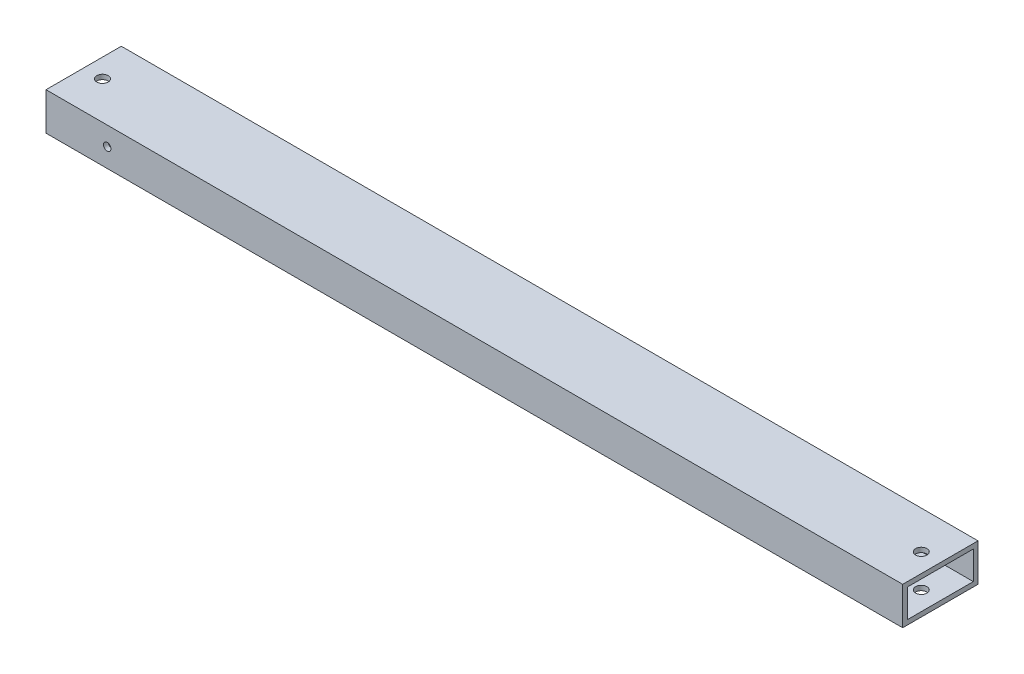
ISO-10303-21;
HEADER;
FILE_DESCRIPTION(('STEP AP214'),'2;1');
FILE_NAME('part.step','',(''),(''),'','','');
FILE_SCHEMA(('AUTOMOTIVE_DESIGN { 1 0 10303 214 1 1 1 1 }'));
ENDSEC;
DATA;
#1=APPLICATION_CONTEXT('core data for automotive mechanical design processes');
#2=APPLICATION_PROTOCOL_DEFINITION('international standard','automotive_design',2000,#1);
#3=PRODUCT_CONTEXT('',#1,'mechanical');
#4=PRODUCT('Part','Part','',(#3));
#5=PRODUCT_RELATED_PRODUCT_CATEGORY('part','',(#4));
#6=PRODUCT_DEFINITION_FORMATION('','',#4);
#7=PRODUCT_DEFINITION_CONTEXT('part definition',#1,'design');
#8=PRODUCT_DEFINITION('design','',#6,#7);
#9=PRODUCT_DEFINITION_SHAPE('','',#8);
#10=(LENGTH_UNIT() NAMED_UNIT(*) SI_UNIT(.MILLI.,.METRE.));
#11=(NAMED_UNIT(*) PLANE_ANGLE_UNIT() SI_UNIT($,.RADIAN.));
#12=(NAMED_UNIT(*) SI_UNIT($,.STERADIAN.) SOLID_ANGLE_UNIT());
#13=UNCERTAINTY_MEASURE_WITH_UNIT(LENGTH_MEASURE(1.E-05),#10,'distance_accuracy_value','');
#14=(GEOMETRIC_REPRESENTATION_CONTEXT(3) GLOBAL_UNCERTAINTY_ASSIGNED_CONTEXT((#13)) GLOBAL_UNIT_ASSIGNED_CONTEXT((#10,
#11,#12)) REPRESENTATION_CONTEXT('',''));
#15=CARTESIAN_POINT('',(0.,0.,0.));
#16=DIRECTION('',(0.,0.,1.));
#17=DIRECTION('',(1.,0.,0.));
#18=AXIS2_PLACEMENT_3D('',#15,#16,#17);
#19=CARTESIAN_POINT('',(238.313908971209,-659.905523336291,-866.236135779287));
#20=DIRECTION('',(0.,-1.,0.));
#21=DIRECTION('',(0.,0.,-1.));
#22=AXIS2_PLACEMENT_3D('',#19,#20,#21);
#23=CYLINDRICAL_SURFACE('',#22,6.);
#24=CARTESIAN_POINT('',(238.313908971209,-664.905523336291,-866.236135779287));
#25=DIRECTION('',(0.,-1.,0.));
#26=DIRECTION('',(0.,0.,-1.));
#27=AXIS2_PLACEMENT_3D('',#24,#25,#26);
#28=CIRCLE('',#27,6.);
#29=CARTESIAN_POINT('',(238.313908971209,-664.905523336291,-872.236135779287));
#30=VERTEX_POINT('',#29);
#31=EDGE_CURVE('E18',#30,#30,#28,.F.);
#32=ORIENTED_EDGE('',*,*,#31,.F.);
#33=EDGE_LOOP('',(#32));
#34=FACE_BOUND('',#33,.T.);
#35=CARTESIAN_POINT('',(238.313908971209,-659.905523336291,-866.236135779287));
#36=DIRECTION('',(0.,-1.,0.));
#37=DIRECTION('',(0.,0.,-1.));
#38=AXIS2_PLACEMENT_3D('',#35,#36,#37);
#39=CIRCLE('',#38,6.);
#40=CARTESIAN_POINT('',(238.313908971209,-659.905523336291,-872.236135779287));
#41=VERTEX_POINT('',#40);
#42=EDGE_CURVE('E143',#41,#41,#39,.F.);
#43=ORIENTED_EDGE('',*,*,#42,.T.);
#44=EDGE_LOOP('',(#43));
#45=FACE_BOUND('',#44,.T.);
#46=ADVANCED_FACE('F15',(#34,#45),#23,.F.);
#47=CARTESIAN_POINT('',(-631.679347611488,-699.905523336291,-866.486147986318));
#48=DIRECTION('',(0.,1.,0.));
#49=DIRECTION('',(0.,0.,1.));
#50=AXIS2_PLACEMENT_3D('',#47,#48,#49);
#51=CYLINDRICAL_SURFACE('',#50,6.);
#52=CARTESIAN_POINT('',(-631.679347611488,-664.905523336291,-866.486147986318));
#53=DIRECTION('',(0.,1.,0.));
#54=DIRECTION('',(0.,0.,1.));
#55=AXIS2_PLACEMENT_3D('',#52,#53,#54);
#56=CIRCLE('',#55,6.);
#57=CARTESIAN_POINT('',(-631.679347611488,-664.905523336291,-860.486147986318));
#58=VERTEX_POINT('',#57);
#59=EDGE_CURVE('E116',#58,#58,#56,.T.);
#60=ORIENTED_EDGE('',*,*,#59,.F.);
#61=EDGE_LOOP('',(#60));
#62=FACE_BOUND('',#61,.T.);
#63=CARTESIAN_POINT('',(-631.679347611488,-659.905523336291,-866.486147986318));
#64=DIRECTION('',(0.,1.,0.));
#65=DIRECTION('',(0.,0.,1.));
#66=AXIS2_PLACEMENT_3D('',#63,#64,#65);
#67=CIRCLE('',#66,6.);
#68=CARTESIAN_POINT('',(-631.679347611488,-659.905523336291,-860.486147986318));
#69=VERTEX_POINT('',#68);
#70=EDGE_CURVE('E140',#69,#69,#67,.T.);
#71=ORIENTED_EDGE('',*,*,#70,.T.);
#72=EDGE_LOOP('',(#71));
#73=FACE_BOUND('',#72,.T.);
#74=ADVANCED_FACE('F157',(#62,#73),#51,.F.);
#75=CARTESIAN_POINT('',(-586.679347611488,-679.845523336292,-898.986147986318));
#76=DIRECTION('',(0.,0.,-1.));
#77=DIRECTION('',(-1.,0.,0.));
#78=AXIS2_PLACEMENT_3D('',#75,#76,#77);
#79=CYLINDRICAL_SURFACE('',#78,4.);
#80=CARTESIAN_POINT('',(-586.679347611488,-679.845523336292,-901.486147986318));
#81=DIRECTION('',(0.,0.,-1.));
#82=DIRECTION('',(-1.,0.,0.));
#83=AXIS2_PLACEMENT_3D('',#80,#81,#82);
#84=CIRCLE('',#83,4.);
#85=CARTESIAN_POINT('',(-590.679347611488,-679.845523336292,-901.486147986318));
#86=VERTEX_POINT('',#85);
#87=EDGE_CURVE('E115',#86,#86,#84,.T.);
#88=ORIENTED_EDGE('',*,*,#87,.F.);
#89=EDGE_LOOP('',(#88));
#90=FACE_BOUND('',#89,.T.);
#91=CARTESIAN_POINT('',(-586.679347611488,-679.845523336292,-906.486147986318));
#92=DIRECTION('',(0.,0.,-1.));
#93=DIRECTION('',(-1.,0.,0.));
#94=AXIS2_PLACEMENT_3D('',#91,#92,#93);
#95=CIRCLE('',#94,4.);
#96=CARTESIAN_POINT('',(-590.679347611488,-679.845523336292,-906.486147986318));
#97=VERTEX_POINT('',#96);
#98=EDGE_CURVE('E133',#97,#97,#95,.T.);
#99=ORIENTED_EDGE('',*,*,#98,.T.);
#100=EDGE_LOOP('',(#99));
#101=FACE_BOUND('',#100,.T.);
#102=ADVANCED_FACE('F251',(#90,#101),#79,.F.);
#103=CARTESIAN_POINT('',(-201.679347611488,-679.905523336292,-831.486147986319));
#104=DIRECTION('',(0.,0.,-1.));
#105=DIRECTION('',(-1.,0.,0.));
#106=AXIS2_PLACEMENT_3D('',#103,#104,#105);
#107=PLANE('',#106);
#108=CARTESIAN_POINT('',(-586.679347611488,-679.845523336292,-831.486147986319));
#109=DIRECTION('',(0.,0.,1.));
#110=DIRECTION('',(1.,0.,0.));
#111=AXIS2_PLACEMENT_3D('',#108,#109,#110);
#112=CIRCLE('',#111,4.);
#113=CARTESIAN_POINT('',(-582.679347611488,-679.845523336292,-831.486147986319));
#114=VERTEX_POINT('',#113);
#115=EDGE_CURVE('E113',#114,#114,#112,.T.);
#116=ORIENTED_EDGE('',*,*,#115,.T.);
#117=EDGE_LOOP('',(#116));
#118=FACE_BOUND('',#117,.T.);
#119=DIRECTION('',(1.,0.,0.));
#120=VECTOR('',#119,1.);
#121=CARTESIAN_POINT('',(-201.679347611488,-694.905523336291,-831.486147986319));
#122=LINE('',#121,#120);
#123=CARTESIAN_POINT('',(-651.679347611489,-694.905523336291,-831.486147986319));
#124=VERTEX_POINT('',#123);
#125=CARTESIAN_POINT('',(258.313908971212,-694.905523336291,-831.486147986319));
#126=VERTEX_POINT('',#125);
#127=EDGE_CURVE('E103',#124,#126,#122,.T.);
#128=ORIENTED_EDGE('',*,*,#127,.F.);
#129=DIRECTION('',(0.,1.,0.));
#130=VECTOR('',#129,1.);
#131=CARTESIAN_POINT('',(-651.679347611489,-679.905523336292,-831.486147986319));
#132=LINE('',#131,#130);
#133=CARTESIAN_POINT('',(-651.679347611489,-664.905523336291,-831.486147986319));
#134=VERTEX_POINT('',#133);
#135=EDGE_CURVE('E189',#124,#134,#132,.T.);
#136=ORIENTED_EDGE('',*,*,#135,.T.);
#137=DIRECTION('',(1.,0.,0.));
#138=VECTOR('',#137,1.);
#139=CARTESIAN_POINT('',(-201.679347611488,-664.905523336291,-831.486147986319));
#140=LINE('',#139,#138);
#141=CARTESIAN_POINT('',(258.313908971212,-664.905523336291,-831.486147986319));
#142=VERTEX_POINT('',#141);
#143=EDGE_CURVE('E117',#142,#134,#140,.F.);
#144=ORIENTED_EDGE('',*,*,#143,.F.);
#145=DIRECTION('',(0.,1.,0.));
#146=VECTOR('',#145,1.);
#147=CARTESIAN_POINT('',(258.313908971212,-680.155520569218,-831.486147986319));
#148=LINE('',#147,#146);
#149=EDGE_CURVE('E106',#126,#142,#148,.T.);
#150=ORIENTED_EDGE('',*,*,#149,.F.);
#151=EDGE_LOOP('',(#128,#136,#144,#150));
#152=FACE_BOUND('',#151,.T.);
#153=ADVANCED_FACE('F248',(#118,#152),#107,.T.);
#154=CARTESIAN_POINT('',(-201.679347611488,-664.905523336291,-866.486147986318));
#155=DIRECTION('',(0.,-1.,0.));
#156=DIRECTION('',(0.,0.,-1.));
#157=AXIS2_PLACEMENT_3D('',#154,#155,#156);
#158=PLANE('',#157);
#159=ORIENTED_EDGE('',*,*,#59,.T.);
#160=EDGE_LOOP('',(#159));
#161=FACE_BOUND('',#160,.T.);
#162=ORIENTED_EDGE('',*,*,#31,.T.);
#163=EDGE_LOOP('',(#162));
#164=FACE_BOUND('',#163,.T.);
#165=ORIENTED_EDGE('',*,*,#143,.T.);
#166=DIRECTION('',(0.,0.,-1.));
#167=VECTOR('',#166,1.);
#168=CARTESIAN_POINT('',(-651.679347611489,-664.905523336291,-866.486147986318));
#169=LINE('',#168,#167);
#170=CARTESIAN_POINT('',(-651.679347611489,-664.905523336291,-901.486147986318));
#171=VERTEX_POINT('',#170);
#172=EDGE_CURVE('E187',#134,#171,#169,.T.);
#173=ORIENTED_EDGE('',*,*,#172,.T.);
#174=DIRECTION('',(1.,0.,0.));
#175=VECTOR('',#174,1.);
#176=CARTESIAN_POINT('',(-201.679347611488,-664.905523336291,-901.486147986318));
#177=LINE('',#176,#175);
#178=CARTESIAN_POINT('',(258.313908971212,-664.905523336291,-901.486147986318));
#179=VERTEX_POINT('',#178);
#180=EDGE_CURVE('E78',#179,#171,#177,.F.);
#181=ORIENTED_EDGE('',*,*,#180,.F.);
#182=DIRECTION('',(0.,0.,-1.));
#183=VECTOR('',#182,1.);
#184=CARTESIAN_POINT('',(258.313908971212,-664.905523336291,-866.486147986318));
#185=LINE('',#184,#183);
#186=EDGE_CURVE('E91',#142,#179,#185,.T.);
#187=ORIENTED_EDGE('',*,*,#186,.F.);
#188=EDGE_LOOP('',(#165,#173,#181,#187));
#189=FACE_BOUND('',#188,.T.);
#190=ADVANCED_FACE('F153',(#161,#164,#189),#158,.T.);
#191=CARTESIAN_POINT('',(-201.679347611488,-679.905523336292,-901.486147986318));
#192=DIRECTION('',(0.,0.,1.));
#193=DIRECTION('',(1.,0.,0.));
#194=AXIS2_PLACEMENT_3D('',#191,#192,#193);
#195=PLANE('',#194);
#196=ORIENTED_EDGE('',*,*,#87,.T.);
#197=EDGE_LOOP('',(#196));
#198=FACE_BOUND('',#197,.T.);
#199=ORIENTED_EDGE('',*,*,#180,.T.);
#200=DIRECTION('',(0.,1.,0.));
#201=VECTOR('',#200,1.);
#202=CARTESIAN_POINT('',(-651.679347611489,-679.905523336292,-901.486147986318));
#203=LINE('',#202,#201);
#204=CARTESIAN_POINT('',(-651.679347611489,-694.905523336291,-901.486147986318));
#205=VERTEX_POINT('',#204);
#206=EDGE_CURVE('E99',#171,#205,#203,.F.);
#207=ORIENTED_EDGE('',*,*,#206,.T.);
#208=DIRECTION('',(1.,0.,0.));
#209=VECTOR('',#208,1.);
#210=CARTESIAN_POINT('',(-201.679347611488,-694.905523336291,-901.486147986318));
#211=LINE('',#210,#209);
#212=CARTESIAN_POINT('',(258.313908971212,-694.905523336291,-901.486147986318));
#213=VERTEX_POINT('',#212);
#214=EDGE_CURVE('E96',#213,#205,#211,.F.);
#215=ORIENTED_EDGE('',*,*,#214,.F.);
#216=DIRECTION('',(0.,1.,0.));
#217=VECTOR('',#216,1.);
#218=CARTESIAN_POINT('',(258.313908971212,-680.155520569218,-901.486147986318));
#219=LINE('',#218,#217);
#220=EDGE_CURVE('E84',#179,#213,#219,.F.);
#221=ORIENTED_EDGE('',*,*,#220,.F.);
#222=EDGE_LOOP('',(#199,#207,#215,#221));
#223=FACE_BOUND('',#222,.T.);
#224=ADVANCED_FACE('F97',(#198,#223),#195,.T.);
#225=CARTESIAN_POINT('',(-201.679347611488,-659.905523336291,-866.486147986318));
#226=DIRECTION('',(0.,-1.,0.));
#227=DIRECTION('',(0.,0.,-1.));
#228=AXIS2_PLACEMENT_3D('',#225,#226,#227);
#229=PLANE('',#228);
#230=ORIENTED_EDGE('',*,*,#70,.F.);
#231=EDGE_LOOP('',(#230));
#232=FACE_BOUND('',#231,.T.);
#233=ORIENTED_EDGE('',*,*,#42,.F.);
#234=EDGE_LOOP('',(#233));
#235=FACE_BOUND('',#234,.T.);
#236=DIRECTION('',(0.,0.,-1.));
#237=VECTOR('',#236,1.);
#238=CARTESIAN_POINT('',(-651.679347611489,-659.905523336291,-866.486147986318));
#239=LINE('',#238,#237);
#240=CARTESIAN_POINT('',(-651.679347611489,-659.905523336291,-906.486147986318));
#241=VERTEX_POINT('',#240);
#242=CARTESIAN_POINT('',(-651.679347611489,-659.905523336291,-826.486147986318));
#243=VERTEX_POINT('',#242);
#244=EDGE_CURVE('E136',#241,#243,#239,.F.);
#245=ORIENTED_EDGE('',*,*,#244,.T.);
#246=DIRECTION('',(-1.,0.,0.));
#247=VECTOR('',#246,1.);
#248=CARTESIAN_POINT('',(-201.679347611488,-659.905523336291,-826.486147986318));
#249=LINE('',#248,#247);
#250=CARTESIAN_POINT('',(258.313908971212,-659.905523336291,-826.486147986318));
#251=VERTEX_POINT('',#250);
#252=EDGE_CURVE('E132',#243,#251,#249,.F.);
#253=ORIENTED_EDGE('',*,*,#252,.T.);
#254=DIRECTION('',(0.,0.,-1.));
#255=VECTOR('',#254,1.);
#256=CARTESIAN_POINT('',(258.313908971212,-659.905523336291,-866.486147986318));
#257=LINE('',#256,#255);
#258=CARTESIAN_POINT('',(258.313908971212,-659.905523336291,-906.486147986318));
#259=VERTEX_POINT('',#258);
#260=EDGE_CURVE('E93',#259,#251,#257,.F.);
#261=ORIENTED_EDGE('',*,*,#260,.F.);
#262=DIRECTION('',(1.,0.,0.));
#263=VECTOR('',#262,1.);
#264=CARTESIAN_POINT('',(-201.679347611488,-659.905523336291,-906.486147986318));
#265=LINE('',#264,#263);
#266=EDGE_CURVE('E137',#259,#241,#265,.F.);
#267=ORIENTED_EDGE('',*,*,#266,.T.);
#268=EDGE_LOOP('',(#245,#253,#261,#267));
#269=FACE_BOUND('',#268,.T.);
#270=ADVANCED_FACE('F160',(#232,#235,#269),#229,.F.);
#271=CARTESIAN_POINT('',(-586.679347611488,-679.845523336292,-833.986147986319));
#272=DIRECTION('',(0.,0.,1.));
#273=DIRECTION('',(1.,0.,0.));
#274=AXIS2_PLACEMENT_3D('',#271,#272,#273);
#275=CYLINDRICAL_SURFACE('',#274,4.);
#276=ORIENTED_EDGE('',*,*,#115,.F.);
#277=EDGE_LOOP('',(#276));
#278=FACE_BOUND('',#277,.T.);
#279=CARTESIAN_POINT('',(-586.679347611488,-679.845523336292,-826.486147986318));
#280=DIRECTION('',(0.,0.,1.));
#281=DIRECTION('',(1.,0.,0.));
#282=AXIS2_PLACEMENT_3D('',#279,#280,#281);
#283=CIRCLE('',#282,4.);
#284=CARTESIAN_POINT('',(-582.679347611488,-679.845523336292,-826.486147986318));
#285=VERTEX_POINT('',#284);
#286=EDGE_CURVE('E129',#285,#285,#283,.T.);
#287=ORIENTED_EDGE('',*,*,#286,.T.);
#288=EDGE_LOOP('',(#287));
#289=FACE_BOUND('',#288,.T.);
#290=ADVANCED_FACE('F163',(#278,#289),#275,.F.);
#291=CARTESIAN_POINT('',(-201.679347611488,-694.905523336291,-866.486147986318));
#292=DIRECTION('',(0.,1.,0.));
#293=DIRECTION('',(0.,0.,1.));
#294=AXIS2_PLACEMENT_3D('',#291,#292,#293);
#295=PLANE('',#294);
#296=CARTESIAN_POINT('',(-631.679347611488,-694.905523336291,-866.486147986318));
#297=DIRECTION('',(0.,1.,0.));
#298=DIRECTION('',(0.,0.,1.));
#299=AXIS2_PLACEMENT_3D('',#296,#297,#298);
#300=CIRCLE('',#299,6.);
#301=CARTESIAN_POINT('',(-631.679347611488,-694.905523336291,-860.486147986318));
#302=VERTEX_POINT('',#301);
#303=EDGE_CURVE('E122',#302,#302,#300,.F.);
#304=ORIENTED_EDGE('',*,*,#303,.T.);
#305=EDGE_LOOP('',(#304));
#306=FACE_BOUND('',#305,.T.);
#307=CARTESIAN_POINT('',(238.313908971209,-694.905523336291,-866.236135779287));
#308=DIRECTION('',(0.,-1.,0.));
#309=DIRECTION('',(0.,0.,-1.));
#310=AXIS2_PLACEMENT_3D('',#307,#308,#309);
#311=CIRCLE('',#310,6.);
#312=CARTESIAN_POINT('',(238.313908971209,-694.905523336291,-872.236135779287));
#313=VERTEX_POINT('',#312);
#314=EDGE_CURVE('E126',#313,#313,#311,.T.);
#315=ORIENTED_EDGE('',*,*,#314,.T.);
#316=EDGE_LOOP('',(#315));
#317=FACE_BOUND('',#316,.T.);
#318=ORIENTED_EDGE('',*,*,#214,.T.);
#319=DIRECTION('',(0.,0.,-1.));
#320=VECTOR('',#319,1.);
#321=CARTESIAN_POINT('',(-651.679347611489,-694.905523336291,-866.486147986318));
#322=LINE('',#321,#320);
#323=EDGE_CURVE('E192',#205,#124,#322,.F.);
#324=ORIENTED_EDGE('',*,*,#323,.T.);
#325=ORIENTED_EDGE('',*,*,#127,.T.);
#326=DIRECTION('',(0.,0.,-1.));
#327=VECTOR('',#326,1.);
#328=CARTESIAN_POINT('',(258.313908971212,-694.905523336291,-866.486147986318));
#329=LINE('',#328,#327);
#330=EDGE_CURVE('E89',#213,#126,#329,.F.);
#331=ORIENTED_EDGE('',*,*,#330,.F.);
#332=EDGE_LOOP('',(#318,#324,#325,#331));
#333=FACE_BOUND('',#332,.T.);
#334=ADVANCED_FACE('F105',(#306,#317,#333),#295,.T.);
#335=CARTESIAN_POINT('',(258.313908971212,-680.155520569218,-866.486147986318));
#336=DIRECTION('',(1.,0.,0.));
#337=DIRECTION('',(0.,0.,-1.));
#338=AXIS2_PLACEMENT_3D('',#335,#336,#337);
#339=PLANE('',#338);
#340=ORIENTED_EDGE('',*,*,#149,.T.);
#341=ORIENTED_EDGE('',*,*,#186,.T.);
#342=ORIENTED_EDGE('',*,*,#220,.T.);
#343=ORIENTED_EDGE('',*,*,#330,.T.);
#344=EDGE_LOOP('',(#340,#341,#342,#343));
#345=FACE_BOUND('',#344,.T.);
#346=DIRECTION('',(0.,1.,0.));
#347=VECTOR('',#346,1.);
#348=CARTESIAN_POINT('',(258.313908971212,-679.905523336292,-826.486147986318));
#349=LINE('',#348,#347);
#350=CARTESIAN_POINT('',(258.313908971212,-699.905523336291,-826.486147986318));
#351=VERTEX_POINT('',#350);
#352=EDGE_CURVE('E176',#251,#351,#349,.F.);
#353=ORIENTED_EDGE('',*,*,#352,.T.);
#354=DIRECTION('',(0.,0.,1.));
#355=VECTOR('',#354,1.);
#356=CARTESIAN_POINT('',(258.313908971212,-699.905523336291,-866.486147986318));
#357=LINE('',#356,#355);
#358=CARTESIAN_POINT('',(258.313908971212,-699.905523336291,-906.486147986318));
#359=VERTEX_POINT('',#358);
#360=EDGE_CURVE('E125',#351,#359,#357,.F.);
#361=ORIENTED_EDGE('',*,*,#360,.T.);
#362=DIRECTION('',(0.,1.,0.));
#363=VECTOR('',#362,1.);
#364=CARTESIAN_POINT('',(258.313908971212,-679.905523336292,-906.486147986318));
#365=LINE('',#364,#363);
#366=EDGE_CURVE('E196',#359,#259,#365,.T.);
#367=ORIENTED_EDGE('',*,*,#366,.T.);
#368=ORIENTED_EDGE('',*,*,#260,.T.);
#369=EDGE_LOOP('',(#353,#361,#367,#368));
#370=FACE_BOUND('',#369,.T.);
#371=ADVANCED_FACE('F86',(#345,#370),#339,.T.);
#372=CARTESIAN_POINT('',(-201.679347611488,-679.905523336292,-906.486147986318));
#373=DIRECTION('',(0.,0.,1.));
#374=DIRECTION('',(1.,0.,0.));
#375=AXIS2_PLACEMENT_3D('',#372,#373,#374);
#376=PLANE('',#375);
#377=ORIENTED_EDGE('',*,*,#98,.F.);
#378=EDGE_LOOP('',(#377));
#379=FACE_BOUND('',#378,.T.);
#380=DIRECTION('',(0.,1.,0.));
#381=VECTOR('',#380,1.);
#382=CARTESIAN_POINT('',(-651.679347611489,-679.905523336292,-906.486147986318));
#383=LINE('',#382,#381);
#384=CARTESIAN_POINT('',(-651.679347611489,-699.905523336291,-906.486147986318));
#385=VERTEX_POINT('',#384);
#386=EDGE_CURVE('E171',#385,#241,#383,.T.);
#387=ORIENTED_EDGE('',*,*,#386,.T.);
#388=ORIENTED_EDGE('',*,*,#266,.F.);
#389=ORIENTED_EDGE('',*,*,#366,.F.);
#390=DIRECTION('',(1.,0.,0.));
#391=VECTOR('',#390,1.);
#392=CARTESIAN_POINT('',(-201.679347611488,-699.905523336291,-906.486147986318));
#393=LINE('',#392,#391);
#394=EDGE_CURVE('E203',#359,#385,#393,.F.);
#395=ORIENTED_EDGE('',*,*,#394,.T.);
#396=EDGE_LOOP('',(#387,#388,#389,#395));
#397=FACE_BOUND('',#396,.T.);
#398=ADVANCED_FACE('F202',(#379,#397),#376,.F.);
#399=CARTESIAN_POINT('',(-651.679347611489,-679.905523336292,-866.486147986318));
#400=DIRECTION('',(1.,0.,0.));
#401=DIRECTION('',(0.,0.,-1.));
#402=AXIS2_PLACEMENT_3D('',#399,#400,#401);
#403=PLANE('',#402);
#404=ORIENTED_EDGE('',*,*,#172,.F.);
#405=ORIENTED_EDGE('',*,*,#135,.F.);
#406=ORIENTED_EDGE('',*,*,#323,.F.);
#407=ORIENTED_EDGE('',*,*,#206,.F.);
#408=EDGE_LOOP('',(#404,#405,#406,#407));
#409=FACE_BOUND('',#408,.T.);
#410=DIRECTION('',(0.,0.,1.));
#411=VECTOR('',#410,1.);
#412=CARTESIAN_POINT('',(-651.679347611489,-699.905523336291,-866.486147986318));
#413=LINE('',#412,#411);
#414=CARTESIAN_POINT('',(-651.679347611489,-699.905523336291,-826.486147986318));
#415=VERTEX_POINT('',#414);
#416=EDGE_CURVE('E181',#385,#415,#413,.T.);
#417=ORIENTED_EDGE('',*,*,#416,.T.);
#418=DIRECTION('',(0.,1.,0.));
#419=VECTOR('',#418,1.);
#420=CARTESIAN_POINT('',(-651.679347611489,-679.905523336292,-826.486147986318));
#421=LINE('',#420,#419);
#422=EDGE_CURVE('E33',#415,#243,#421,.T.);
#423=ORIENTED_EDGE('',*,*,#422,.T.);
#424=ORIENTED_EDGE('',*,*,#244,.F.);
#425=ORIENTED_EDGE('',*,*,#386,.F.);
#426=EDGE_LOOP('',(#417,#423,#424,#425));
#427=FACE_BOUND('',#426,.T.);
#428=ADVANCED_FACE('F179',(#409,#427),#403,.F.);
#429=CARTESIAN_POINT('',(-201.679347611488,-679.905523336292,-826.486147986318));
#430=DIRECTION('',(0.,0.,-1.));
#431=DIRECTION('',(-1.,0.,0.));
#432=AXIS2_PLACEMENT_3D('',#429,#430,#431);
#433=PLANE('',#432);
#434=ORIENTED_EDGE('',*,*,#286,.F.);
#435=EDGE_LOOP('',(#434));
#436=FACE_BOUND('',#435,.T.);
#437=ORIENTED_EDGE('',*,*,#422,.F.);
#438=DIRECTION('',(1.,0.,0.));
#439=VECTOR('',#438,1.);
#440=CARTESIAN_POINT('',(-201.679347611488,-699.905523336291,-826.486147986318));
#441=LINE('',#440,#439);
#442=EDGE_CURVE('E121',#415,#351,#441,.T.);
#443=ORIENTED_EDGE('',*,*,#442,.T.);
#444=ORIENTED_EDGE('',*,*,#352,.F.);
#445=ORIENTED_EDGE('',*,*,#252,.F.);
#446=EDGE_LOOP('',(#437,#443,#444,#445));
#447=FACE_BOUND('',#446,.T.);
#448=ADVANCED_FACE('F174',(#436,#447),#433,.F.);
#449=CARTESIAN_POINT('',(238.313908971209,-659.905523336291,-866.236135779287));
#450=DIRECTION('',(0.,-1.,0.));
#451=DIRECTION('',(0.,0.,-1.));
#452=AXIS2_PLACEMENT_3D('',#449,#450,#451);
#453=CYLINDRICAL_SURFACE('',#452,6.);
#454=ORIENTED_EDGE('',*,*,#314,.F.);
#455=EDGE_LOOP('',(#454));
#456=FACE_BOUND('',#455,.T.);
#457=CARTESIAN_POINT('',(238.313908971209,-699.905523336291,-866.236135779287));
#458=DIRECTION('',(0.,-1.,0.));
#459=DIRECTION('',(0.,0.,-1.));
#460=AXIS2_PLACEMENT_3D('',#457,#458,#459);
#461=CIRCLE('',#460,6.);
#462=CARTESIAN_POINT('',(238.313908971209,-699.905523336291,-872.236135779287));
#463=VERTEX_POINT('',#462);
#464=EDGE_CURVE('E24',#463,#463,#461,.T.);
#465=ORIENTED_EDGE('',*,*,#464,.T.);
#466=EDGE_LOOP('',(#465));
#467=FACE_BOUND('',#466,.T.);
#468=ADVANCED_FACE('F217',(#456,#467),#453,.F.);
#469=CARTESIAN_POINT('',(-631.679347611488,-699.905523336291,-866.486147986318));
#470=DIRECTION('',(0.,1.,0.));
#471=DIRECTION('',(0.,0.,1.));
#472=AXIS2_PLACEMENT_3D('',#469,#470,#471);
#473=CYLINDRICAL_SURFACE('',#472,6.);
#474=CARTESIAN_POINT('',(-631.679347611488,-699.905523336291,-866.486147986318));
#475=DIRECTION('',(0.,1.,0.));
#476=DIRECTION('',(0.,0.,1.));
#477=AXIS2_PLACEMENT_3D('',#474,#475,#476);
#478=CIRCLE('',#477,6.);
#479=CARTESIAN_POINT('',(-631.679347611488,-699.905523336291,-860.486147986318));
#480=VERTEX_POINT('',#479);
#481=EDGE_CURVE('E10',#480,#480,#478,.F.);
#482=ORIENTED_EDGE('',*,*,#481,.T.);
#483=EDGE_LOOP('',(#482));
#484=FACE_BOUND('',#483,.T.);
#485=ORIENTED_EDGE('',*,*,#303,.F.);
#486=EDGE_LOOP('',(#485));
#487=FACE_BOUND('',#486,.T.);
#488=ADVANCED_FACE('F210',(#484,#487),#473,.F.);
#489=CARTESIAN_POINT('',(-201.679347611488,-699.905523336291,-866.486147986318));
#490=DIRECTION('',(0.,1.,0.));
#491=DIRECTION('',(0.,0.,1.));
#492=AXIS2_PLACEMENT_3D('',#489,#490,#491);
#493=PLANE('',#492);
#494=ORIENTED_EDGE('',*,*,#481,.F.);
#495=EDGE_LOOP('',(#494));
#496=FACE_BOUND('',#495,.T.);
#497=ORIENTED_EDGE('',*,*,#464,.F.);
#498=EDGE_LOOP('',(#497));
#499=FACE_BOUND('',#498,.T.);
#500=ORIENTED_EDGE('',*,*,#416,.F.);
#501=ORIENTED_EDGE('',*,*,#394,.F.);
#502=ORIENTED_EDGE('',*,*,#360,.F.);
#503=ORIENTED_EDGE('',*,*,#442,.F.);
#504=EDGE_LOOP('',(#500,#501,#502,#503));
#505=FACE_BOUND('',#504,.T.);
#506=ADVANCED_FACE('F205',(#496,#499,#505),#493,.F.);
#507=CLOSED_SHELL('',(#46,#74,#102,#153,#190,#224,#270,#290,#334,#371,#398,#428,#448,#468,#488,#506));
#508=MANIFOLD_SOLID_BREP('B1',#507);
#509=ADVANCED_BREP_SHAPE_REPRESENTATION('',(#18,#508),#14);
#510=SHAPE_DEFINITION_REPRESENTATION(#9,#509);
ENDSEC;
END-ISO-10303-21;
